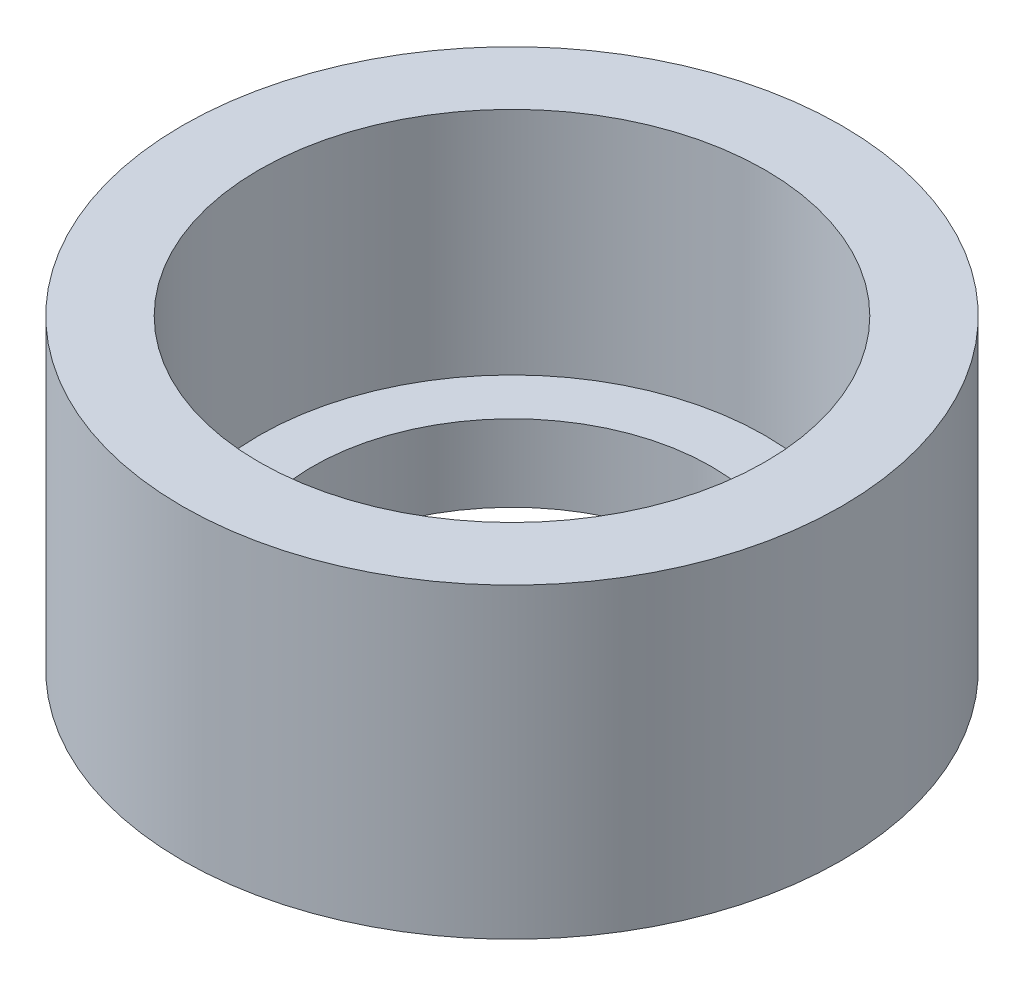
ISO-10303-21;
HEADER;
FILE_DESCRIPTION(('STEP AP214'),'2;1');
FILE_NAME('part.step','',(''),(''),'','','');
FILE_SCHEMA(('AUTOMOTIVE_DESIGN { 1 0 10303 214 1 1 1 1 }'));
ENDSEC;
DATA;
#1=APPLICATION_CONTEXT('core data for automotive mechanical design processes');
#2=APPLICATION_PROTOCOL_DEFINITION('international standard','automotive_design',2000,#1);
#3=PRODUCT_CONTEXT('',#1,'mechanical');
#4=PRODUCT('Part','Part','',(#3));
#5=PRODUCT_RELATED_PRODUCT_CATEGORY('part','',(#4));
#6=PRODUCT_DEFINITION_FORMATION('','',#4);
#7=PRODUCT_DEFINITION_CONTEXT('part definition',#1,'design');
#8=PRODUCT_DEFINITION('design','',#6,#7);
#9=PRODUCT_DEFINITION_SHAPE('','',#8);
#10=(LENGTH_UNIT() NAMED_UNIT(*) SI_UNIT(.MILLI.,.METRE.));
#11=(NAMED_UNIT(*) PLANE_ANGLE_UNIT() SI_UNIT($,.RADIAN.));
#12=(NAMED_UNIT(*) SI_UNIT($,.STERADIAN.) SOLID_ANGLE_UNIT());
#13=UNCERTAINTY_MEASURE_WITH_UNIT(LENGTH_MEASURE(1.E-05),#10,'distance_accuracy_value','');
#14=(GEOMETRIC_REPRESENTATION_CONTEXT(3) GLOBAL_UNCERTAINTY_ASSIGNED_CONTEXT((#13)) GLOBAL_UNIT_ASSIGNED_CONTEXT((#10,
#11,#12)) REPRESENTATION_CONTEXT('',''));
#15=CARTESIAN_POINT('',(0.,0.,0.));
#16=DIRECTION('',(0.,0.,1.));
#17=DIRECTION('',(1.,0.,0.));
#18=AXIS2_PLACEMENT_3D('',#15,#16,#17);
#19=CARTESIAN_POINT('',(0.,0.,0.));
#20=DIRECTION('',(0.,-1.,0.));
#21=DIRECTION('',(0.,0.,-1.));
#22=AXIS2_PLACEMENT_3D('',#19,#20,#21);
#23=PLANE('',#22);
#24=CARTESIAN_POINT('',(0.,0.,0.));
#25=DIRECTION('',(0.,-1.,0.));
#26=DIRECTION('',(0.,0.,-1.));
#27=AXIS2_PLACEMENT_3D('',#24,#25,#26);
#28=CIRCLE('',#27,4.3);
#29=CARTESIAN_POINT('',(0.,0.,-4.3));
#30=VERTEX_POINT('',#29);
#31=EDGE_CURVE('E10',#30,#30,#28,.T.);
#32=ORIENTED_EDGE('',*,*,#31,.T.);
#33=EDGE_LOOP('',(#32));
#34=FACE_BOUND('',#33,.T.);
#35=CARTESIAN_POINT('',(0.,0.,0.));
#36=DIRECTION('',(0.,-1.,0.));
#37=DIRECTION('',(0.,0.,-1.));
#38=AXIS2_PLACEMENT_3D('',#35,#36,#37);
#39=CIRCLE('',#38,2.6);
#40=CARTESIAN_POINT('',(0.,0.,-2.6));
#41=VERTEX_POINT('',#40);
#42=EDGE_CURVE('E55',#41,#41,#39,.T.);
#43=ORIENTED_EDGE('',*,*,#42,.F.);
#44=EDGE_LOOP('',(#43));
#45=FACE_BOUND('',#44,.T.);
#46=ADVANCED_FACE('F33',(#34,#45),#23,.T.);
#47=CARTESIAN_POINT('',(0.,0.,0.));
#48=DIRECTION('',(0.,-1.,0.));
#49=DIRECTION('',(0.,0.,-1.));
#50=AXIS2_PLACEMENT_3D('',#47,#48,#49);
#51=CYLINDRICAL_SURFACE('',#50,4.3);
#52=CARTESIAN_POINT('',(0.,4.,0.));
#53=DIRECTION('',(0.,-1.,0.));
#54=DIRECTION('',(0.,0.,-1.));
#55=AXIS2_PLACEMENT_3D('',#52,#53,#54);
#56=CIRCLE('',#55,4.3);
#57=CARTESIAN_POINT('',(0.,4.,-4.3));
#58=VERTEX_POINT('',#57);
#59=EDGE_CURVE('E39',#58,#58,#56,.T.);
#60=ORIENTED_EDGE('',*,*,#59,.T.);
#61=EDGE_LOOP('',(#60));
#62=FACE_BOUND('',#61,.T.);
#63=ORIENTED_EDGE('',*,*,#31,.F.);
#64=EDGE_LOOP('',(#63));
#65=FACE_BOUND('',#64,.T.);
#66=ADVANCED_FACE('F62',(#62,#65),#51,.T.);
#67=CARTESIAN_POINT('',(0.,4.,0.));
#68=DIRECTION('',(0.,1.,0.));
#69=DIRECTION('',(0.,0.,1.));
#70=AXIS2_PLACEMENT_3D('',#67,#68,#69);
#71=PLANE('',#70);
#72=CARTESIAN_POINT('',(0.,4.,0.));
#73=DIRECTION('',(0.,-1.,0.));
#74=DIRECTION('',(0.,0.,-1.));
#75=AXIS2_PLACEMENT_3D('',#72,#73,#74);
#76=CIRCLE('',#75,3.3);
#77=CARTESIAN_POINT('',(0.,4.,-3.3));
#78=VERTEX_POINT('',#77);
#79=EDGE_CURVE('E43',#78,#78,#76,.T.);
#80=ORIENTED_EDGE('',*,*,#79,.T.);
#81=EDGE_LOOP('',(#80));
#82=FACE_BOUND('',#81,.T.);
#83=ORIENTED_EDGE('',*,*,#59,.F.);
#84=EDGE_LOOP('',(#83));
#85=FACE_BOUND('',#84,.T.);
#86=ADVANCED_FACE('F66',(#82,#85),#71,.T.);
#87=CARTESIAN_POINT('',(0.,0.,0.));
#88=DIRECTION('',(0.,-1.,0.));
#89=DIRECTION('',(0.,0.,-1.));
#90=AXIS2_PLACEMENT_3D('',#87,#88,#89);
#91=CYLINDRICAL_SURFACE('',#90,3.3);
#92=ORIENTED_EDGE('',*,*,#79,.F.);
#93=EDGE_LOOP('',(#92));
#94=FACE_BOUND('',#93,.T.);
#95=CARTESIAN_POINT('',(0.,1.,0.));
#96=DIRECTION('',(0.,-1.,0.));
#97=DIRECTION('',(0.,0.,-1.));
#98=AXIS2_PLACEMENT_3D('',#95,#96,#97);
#99=CIRCLE('',#98,3.3);
#100=CARTESIAN_POINT('',(0.,1.,-3.3));
#101=VERTEX_POINT('',#100);
#102=EDGE_CURVE('E47',#101,#101,#99,.T.);
#103=ORIENTED_EDGE('',*,*,#102,.T.);
#104=EDGE_LOOP('',(#103));
#105=FACE_BOUND('',#104,.T.);
#106=ADVANCED_FACE('F70',(#94,#105),#91,.F.);
#107=CARTESIAN_POINT('',(0.,1.,0.));
#108=DIRECTION('',(0.,-1.,0.));
#109=DIRECTION('',(0.,0.,-1.));
#110=AXIS2_PLACEMENT_3D('',#107,#108,#109);
#111=PLANE('',#110);
#112=ORIENTED_EDGE('',*,*,#102,.F.);
#113=EDGE_LOOP('',(#112));
#114=FACE_BOUND('',#113,.T.);
#115=CARTESIAN_POINT('',(0.,1.,0.));
#116=DIRECTION('',(0.,-1.,0.));
#117=DIRECTION('',(0.,0.,-1.));
#118=AXIS2_PLACEMENT_3D('',#115,#116,#117);
#119=CIRCLE('',#118,2.6);
#120=CARTESIAN_POINT('',(0.,1.,-2.6));
#121=VERTEX_POINT('',#120);
#122=EDGE_CURVE('E52',#121,#121,#119,.T.);
#123=ORIENTED_EDGE('',*,*,#122,.T.);
#124=EDGE_LOOP('',(#123));
#125=FACE_BOUND('',#124,.T.);
#126=ADVANCED_FACE('F77',(#114,#125),#111,.F.);
#127=CARTESIAN_POINT('',(0.,0.,0.));
#128=DIRECTION('',(0.,-1.,0.));
#129=DIRECTION('',(0.,0.,-1.));
#130=AXIS2_PLACEMENT_3D('',#127,#128,#129);
#131=CYLINDRICAL_SURFACE('',#130,2.6);
#132=ORIENTED_EDGE('',*,*,#122,.F.);
#133=EDGE_LOOP('',(#132));
#134=FACE_BOUND('',#133,.T.);
#135=ORIENTED_EDGE('',*,*,#42,.T.);
#136=EDGE_LOOP('',(#135));
#137=FACE_BOUND('',#136,.T.);
#138=ADVANCED_FACE('F59',(#134,#137),#131,.F.);
#139=CLOSED_SHELL('',(#46,#66,#86,#106,#126,#138));
#140=MANIFOLD_SOLID_BREP('B2',#139);
#141=ADVANCED_BREP_SHAPE_REPRESENTATION('',(#18,#140),#14);
#142=SHAPE_DEFINITION_REPRESENTATION(#9,#141);
ENDSEC;
END-ISO-10303-21;
